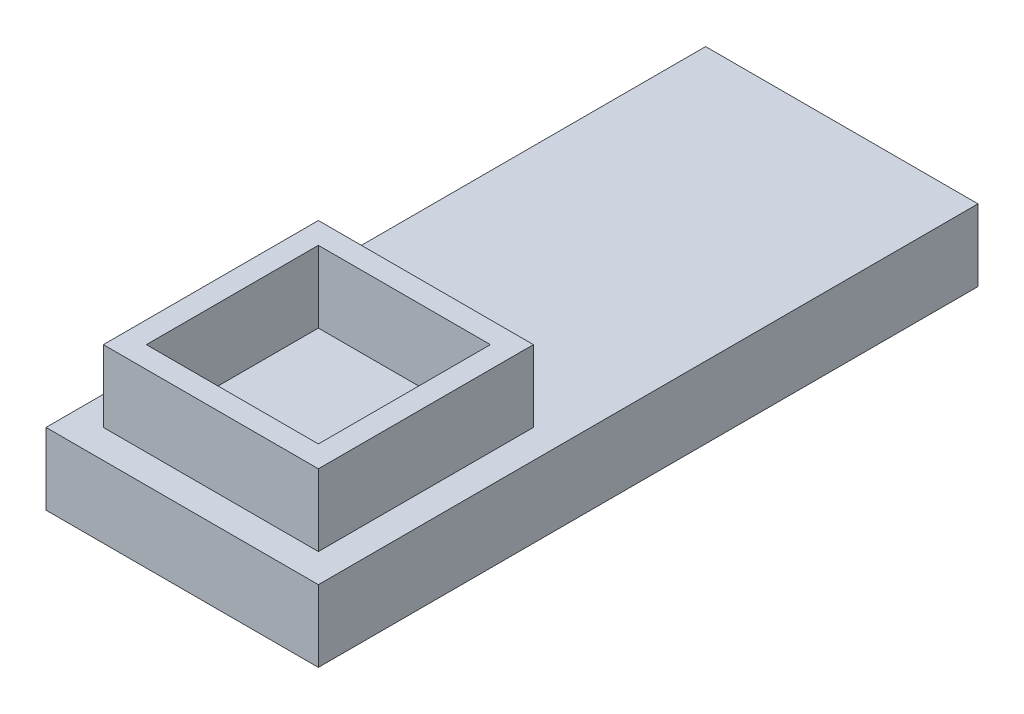
ISO-10303-21;
HEADER;
FILE_DESCRIPTION(('STEP AP214'),'2;1');
FILE_NAME('part.step','',(''),(''),'','','');
FILE_SCHEMA(('AUTOMOTIVE_DESIGN { 1 0 10303 214 1 1 1 1 }'));
ENDSEC;
DATA;
#1=APPLICATION_CONTEXT('core data for automotive mechanical design processes');
#2=APPLICATION_PROTOCOL_DEFINITION('international standard','automotive_design',2000,#1);
#3=PRODUCT_CONTEXT('',#1,'mechanical');
#4=PRODUCT('Part','Part','',(#3));
#5=PRODUCT_RELATED_PRODUCT_CATEGORY('part','',(#4));
#6=PRODUCT_DEFINITION_FORMATION('','',#4);
#7=PRODUCT_DEFINITION_CONTEXT('part definition',#1,'design');
#8=PRODUCT_DEFINITION('design','',#6,#7);
#9=PRODUCT_DEFINITION_SHAPE('','',#8);
#10=(LENGTH_UNIT() NAMED_UNIT(*) SI_UNIT(.MILLI.,.METRE.));
#11=(NAMED_UNIT(*) PLANE_ANGLE_UNIT() SI_UNIT($,.RADIAN.));
#12=(NAMED_UNIT(*) SI_UNIT($,.STERADIAN.) SOLID_ANGLE_UNIT());
#13=UNCERTAINTY_MEASURE_WITH_UNIT(LENGTH_MEASURE(1.E-05),#10,'distance_accuracy_value','');
#14=(GEOMETRIC_REPRESENTATION_CONTEXT(3) GLOBAL_UNCERTAINTY_ASSIGNED_CONTEXT((#13)) GLOBAL_UNIT_ASSIGNED_CONTEXT((#10,
#11,#12)) REPRESENTATION_CONTEXT('',''));
#15=CARTESIAN_POINT('',(0.,0.,0.));
#16=DIRECTION('',(0.,0.,1.));
#17=DIRECTION('',(1.,0.,0.));
#18=AXIS2_PLACEMENT_3D('',#15,#16,#17);
#19=CARTESIAN_POINT('',(0.,10.,0.));
#20=DIRECTION('',(0.,1.,0.));
#21=DIRECTION('',(0.,0.,1.));
#22=AXIS2_PLACEMENT_3D('',#19,#20,#21);
#23=PLANE('',#22);
#24=DIRECTION('',(0.,0.,1.));
#25=VECTOR('',#24,1.);
#26=CARTESIAN_POINT('',(-11.5829012513685,10.,-21.1276817856138));
#27=LINE('',#26,#25);
#28=CARTESIAN_POINT('',(-11.5829012513685,10.,-21.1276817856138));
#29=VERTEX_POINT('',#28);
#30=CARTESIAN_POINT('',(-11.5829012513685,10.,8.87231821438616));
#31=VERTEX_POINT('',#30);
#32=EDGE_CURVE('E101',#29,#31,#27,.T.);
#33=ORIENTED_EDGE('',*,*,#32,.T.);
#34=DIRECTION('',(1.,0.,0.));
#35=VECTOR('',#34,1.);
#36=CARTESIAN_POINT('',(-11.5829012513685,10.,8.87231821438616));
#37=LINE('',#36,#35);
#38=CARTESIAN_POINT('',(18.4170987486315,10.,8.87231821438616));
#39=VERTEX_POINT('',#38);
#40=EDGE_CURVE('E94',#31,#39,#37,.T.);
#41=ORIENTED_EDGE('',*,*,#40,.T.);
#42=DIRECTION('',(0.,0.,-1.));
#43=VECTOR('',#42,1.);
#44=CARTESIAN_POINT('',(18.4170987486315,10.,-21.1276817856138));
#45=LINE('',#44,#43);
#46=CARTESIAN_POINT('',(18.4170987486315,10.,-21.1276817856138));
#47=VERTEX_POINT('',#46);
#48=EDGE_CURVE('E98',#39,#47,#45,.T.);
#49=ORIENTED_EDGE('',*,*,#48,.T.);
#50=DIRECTION('',(-1.,0.,0.));
#51=VECTOR('',#50,1.);
#52=CARTESIAN_POINT('',(-11.5829012513685,10.,-21.1276817856138));
#53=LINE('',#52,#51);
#54=EDGE_CURVE('E57',#47,#29,#53,.T.);
#55=ORIENTED_EDGE('',*,*,#54,.T.);
#56=EDGE_LOOP('',(#33,#41,#49,#55));
#57=FACE_BOUND('',#56,.T.);
#58=DIRECTION('',(1.,0.,0.));
#59=VECTOR('',#58,1.);
#60=CARTESIAN_POINT('',(-8.58290125136849,10.,5.87231821438616));
#61=LINE('',#60,#59);
#62=CARTESIAN_POINT('',(-8.58290125136849,10.,5.87231821438616));
#63=VERTEX_POINT('',#62);
#64=CARTESIAN_POINT('',(15.4170987486315,10.,5.87231821438616));
#65=VERTEX_POINT('',#64);
#66=EDGE_CURVE('E149',#63,#65,#61,.T.);
#67=ORIENTED_EDGE('',*,*,#66,.F.);
#68=DIRECTION('',(0.,0.,1.));
#69=VECTOR('',#68,1.);
#70=CARTESIAN_POINT('',(-8.5829012513685,10.,-18.1276817856138));
#71=LINE('',#70,#69);
#72=CARTESIAN_POINT('',(-8.5829012513685,10.,-18.1276817856138));
#73=VERTEX_POINT('',#72);
#74=EDGE_CURVE('E142',#73,#63,#71,.T.);
#75=ORIENTED_EDGE('',*,*,#74,.F.);
#76=DIRECTION('',(-1.,0.,0.));
#77=VECTOR('',#76,1.);
#78=CARTESIAN_POINT('',(-8.5829012513685,10.,-18.1276817856138));
#79=LINE('',#78,#77);
#80=CARTESIAN_POINT('',(15.4170987486315,10.,-18.1276817856138));
#81=VERTEX_POINT('',#80);
#82=EDGE_CURVE('E78',#81,#73,#79,.T.);
#83=ORIENTED_EDGE('',*,*,#82,.F.);
#84=DIRECTION('',(0.,0.,-1.));
#85=VECTOR('',#84,1.);
#86=CARTESIAN_POINT('',(15.4170987486315,10.,-18.1276817856138));
#87=LINE('',#86,#85);
#88=EDGE_CURVE('E160',#65,#81,#87,.T.);
#89=ORIENTED_EDGE('',*,*,#88,.F.);
#90=EDGE_LOOP('',(#67,#75,#83,#89));
#91=FACE_BOUND('',#90,.T.);
#92=ADVANCED_FACE('F33',(#57,#91),#23,.T.);
#93=CARTESIAN_POINT('',(-11.5829012513685,10.,-21.1276817856138));
#94=DIRECTION('',(1.,0.,0.));
#95=DIRECTION('',(0.,0.,-1.));
#96=AXIS2_PLACEMENT_3D('',#93,#94,#95);
#97=PLANE('',#96);
#98=DIRECTION('',(0.,0.,1.));
#99=VECTOR('',#98,1.);
#100=CARTESIAN_POINT('',(-11.5829012513685,0.,-21.1276817856138));
#101=LINE('',#100,#99);
#102=CARTESIAN_POINT('',(-11.5829012513685,0.,-21.1276817856138));
#103=VERTEX_POINT('',#102);
#104=CARTESIAN_POINT('',(-11.5829012513685,0.,8.87231821438616));
#105=VERTEX_POINT('',#104);
#106=EDGE_CURVE('E117',#103,#105,#101,.T.);
#107=ORIENTED_EDGE('',*,*,#106,.T.);
#108=DIRECTION('',(0.,-1.,0.));
#109=VECTOR('',#108,1.);
#110=CARTESIAN_POINT('',(-11.5829012513685,10.,8.87231821438616));
#111=LINE('',#110,#109);
#112=EDGE_CURVE('E11',#31,#105,#111,.T.);
#113=ORIENTED_EDGE('',*,*,#112,.F.);
#114=ORIENTED_EDGE('',*,*,#32,.F.);
#115=DIRECTION('',(0.,-1.,0.));
#116=VECTOR('',#115,1.);
#117=CARTESIAN_POINT('',(-11.5829012513685,10.,-21.1276817856138));
#118=LINE('',#117,#116);
#119=EDGE_CURVE('E113',#29,#103,#118,.T.);
#120=ORIENTED_EDGE('',*,*,#119,.T.);
#121=EDGE_LOOP('',(#107,#113,#114,#120));
#122=FACE_BOUND('',#121,.T.);
#123=ADVANCED_FACE('F35',(#122),#97,.F.);
#124=CARTESIAN_POINT('',(-11.5829012513685,10.,8.87231821438616));
#125=DIRECTION('',(0.,0.,-1.));
#126=DIRECTION('',(-1.,0.,0.));
#127=AXIS2_PLACEMENT_3D('',#124,#125,#126);
#128=PLANE('',#127);
#129=DIRECTION('',(1.,0.,0.));
#130=VECTOR('',#129,1.);
#131=CARTESIAN_POINT('',(-11.5829012513685,0.,8.87231821438616));
#132=LINE('',#131,#130);
#133=CARTESIAN_POINT('',(18.4170987486315,0.,8.87231821438616));
#134=VERTEX_POINT('',#133);
#135=EDGE_CURVE('E107',#105,#134,#132,.T.);
#136=ORIENTED_EDGE('',*,*,#135,.T.);
#137=DIRECTION('',(0.,-1.,0.));
#138=VECTOR('',#137,1.);
#139=CARTESIAN_POINT('',(18.4170987486315,10.,8.87231821438616));
#140=LINE('',#139,#138);
#141=EDGE_CURVE('E41',#39,#134,#140,.T.);
#142=ORIENTED_EDGE('',*,*,#141,.F.);
#143=ORIENTED_EDGE('',*,*,#40,.F.);
#144=ORIENTED_EDGE('',*,*,#112,.T.);
#145=EDGE_LOOP('',(#136,#142,#143,#144));
#146=FACE_BOUND('',#145,.T.);
#147=ADVANCED_FACE('F106',(#146),#128,.F.);
#148=CARTESIAN_POINT('',(18.4170987486315,10.,-21.1276817856138));
#149=DIRECTION('',(-1.,0.,0.));
#150=DIRECTION('',(0.,0.,1.));
#151=AXIS2_PLACEMENT_3D('',#148,#149,#150);
#152=PLANE('',#151);
#153=DIRECTION('',(0.,0.,-1.));
#154=VECTOR('',#153,1.);
#155=CARTESIAN_POINT('',(18.4170987486315,0.,-21.1276817856138));
#156=LINE('',#155,#154);
#157=CARTESIAN_POINT('',(18.4170987486315,0.,-21.1276817856138));
#158=VERTEX_POINT('',#157);
#159=EDGE_CURVE('E70',#134,#158,#156,.T.);
#160=ORIENTED_EDGE('',*,*,#159,.T.);
#161=DIRECTION('',(0.,-1.,0.));
#162=VECTOR('',#161,1.);
#163=CARTESIAN_POINT('',(18.4170987486315,10.,-21.1276817856138));
#164=LINE('',#163,#162);
#165=EDGE_CURVE('E109',#47,#158,#164,.T.);
#166=ORIENTED_EDGE('',*,*,#165,.F.);
#167=ORIENTED_EDGE('',*,*,#48,.F.);
#168=ORIENTED_EDGE('',*,*,#141,.T.);
#169=EDGE_LOOP('',(#160,#166,#167,#168));
#170=FACE_BOUND('',#169,.T.);
#171=ADVANCED_FACE('F110',(#170),#152,.F.);
#172=CARTESIAN_POINT('',(-11.5829012513685,10.,-21.1276817856138));
#173=DIRECTION('',(0.,0.,1.));
#174=DIRECTION('',(1.,0.,0.));
#175=AXIS2_PLACEMENT_3D('',#172,#173,#174);
#176=PLANE('',#175);
#177=DIRECTION('',(-1.,0.,0.));
#178=VECTOR('',#177,1.);
#179=CARTESIAN_POINT('',(-11.5829012513685,0.,-21.1276817856138));
#180=LINE('',#179,#178);
#181=EDGE_CURVE('E123',#158,#103,#180,.T.);
#182=ORIENTED_EDGE('',*,*,#181,.T.);
#183=ORIENTED_EDGE('',*,*,#119,.F.);
#184=ORIENTED_EDGE('',*,*,#54,.F.);
#185=ORIENTED_EDGE('',*,*,#165,.T.);
#186=EDGE_LOOP('',(#182,#183,#184,#185));
#187=FACE_BOUND('',#186,.T.);
#188=ADVANCED_FACE('F130',(#187),#176,.F.);
#189=CARTESIAN_POINT('',(-8.5829012513685,10.,-18.1276817856138));
#190=DIRECTION('',(1.,0.,0.));
#191=DIRECTION('',(0.,0.,-1.));
#192=AXIS2_PLACEMENT_3D('',#189,#190,#191);
#193=PLANE('',#192);
#194=DIRECTION('',(0.,0.,1.));
#195=VECTOR('',#194,1.);
#196=CARTESIAN_POINT('',(-8.5829012513685,0.,-18.1276817856138));
#197=LINE('',#196,#195);
#198=CARTESIAN_POINT('',(-8.5829012513685,0.,-18.1276817856138));
#199=VERTEX_POINT('',#198);
#200=CARTESIAN_POINT('',(-8.58290125136849,0.,5.87231821438616));
#201=VERTEX_POINT('',#200);
#202=EDGE_CURVE('E166',#199,#201,#197,.T.);
#203=ORIENTED_EDGE('',*,*,#202,.F.);
#204=DIRECTION('',(0.,-1.,0.));
#205=VECTOR('',#204,1.);
#206=CARTESIAN_POINT('',(-8.5829012513685,10.,-18.1276817856138));
#207=LINE('',#206,#205);
#208=EDGE_CURVE('E147',#73,#199,#207,.T.);
#209=ORIENTED_EDGE('',*,*,#208,.F.);
#210=ORIENTED_EDGE('',*,*,#74,.T.);
#211=DIRECTION('',(0.,-1.,0.));
#212=VECTOR('',#211,1.);
#213=CARTESIAN_POINT('',(-8.58290125136849,10.,5.87231821438616));
#214=LINE('',#213,#212);
#215=EDGE_CURVE('E120',#63,#201,#214,.T.);
#216=ORIENTED_EDGE('',*,*,#215,.T.);
#217=EDGE_LOOP('',(#203,#209,#210,#216));
#218=FACE_BOUND('',#217,.T.);
#219=ADVANCED_FACE('F145',(#218),#193,.T.);
#220=CARTESIAN_POINT('',(-8.58290125136849,10.,5.87231821438616));
#221=DIRECTION('',(0.,0.,-1.));
#222=DIRECTION('',(-1.,0.,0.));
#223=AXIS2_PLACEMENT_3D('',#220,#221,#222);
#224=PLANE('',#223);
#225=DIRECTION('',(1.,0.,0.));
#226=VECTOR('',#225,1.);
#227=CARTESIAN_POINT('',(-8.58290125136849,0.,5.87231821438616));
#228=LINE('',#227,#226);
#229=CARTESIAN_POINT('',(15.4170987486315,0.,5.87231821438616));
#230=VERTEX_POINT('',#229);
#231=EDGE_CURVE('E156',#201,#230,#228,.T.);
#232=ORIENTED_EDGE('',*,*,#231,.F.);
#233=ORIENTED_EDGE('',*,*,#215,.F.);
#234=ORIENTED_EDGE('',*,*,#66,.T.);
#235=DIRECTION('',(0.,-1.,0.));
#236=VECTOR('',#235,1.);
#237=CARTESIAN_POINT('',(15.4170987486315,10.,5.87231821438616));
#238=LINE('',#237,#236);
#239=EDGE_CURVE('E157',#65,#230,#238,.T.);
#240=ORIENTED_EDGE('',*,*,#239,.T.);
#241=EDGE_LOOP('',(#232,#233,#234,#240));
#242=FACE_BOUND('',#241,.T.);
#243=ADVANCED_FACE('F153',(#242),#224,.T.);
#244=CARTESIAN_POINT('',(15.4170987486315,10.,-18.1276817856138));
#245=DIRECTION('',(-1.,0.,0.));
#246=DIRECTION('',(0.,0.,1.));
#247=AXIS2_PLACEMENT_3D('',#244,#245,#246);
#248=PLANE('',#247);
#249=DIRECTION('',(0.,0.,-1.));
#250=VECTOR('',#249,1.);
#251=CARTESIAN_POINT('',(15.4170987486315,0.,-18.1276817856138));
#252=LINE('',#251,#250);
#253=CARTESIAN_POINT('',(15.4170987486315,0.,-18.1276817856138));
#254=VERTEX_POINT('',#253);
#255=EDGE_CURVE('E170',#230,#254,#252,.T.);
#256=ORIENTED_EDGE('',*,*,#255,.F.);
#257=ORIENTED_EDGE('',*,*,#239,.F.);
#258=ORIENTED_EDGE('',*,*,#88,.T.);
#259=DIRECTION('',(0.,-1.,0.));
#260=VECTOR('',#259,1.);
#261=CARTESIAN_POINT('',(15.4170987486315,10.,-18.1276817856138));
#262=LINE('',#261,#260);
#263=EDGE_CURVE('E48',#81,#254,#262,.T.);
#264=ORIENTED_EDGE('',*,*,#263,.T.);
#265=EDGE_LOOP('',(#256,#257,#258,#264));
#266=FACE_BOUND('',#265,.T.);
#267=ADVANCED_FACE('F179',(#266),#248,.T.);
#268=CARTESIAN_POINT('',(-8.5829012513685,10.,-18.1276817856138));
#269=DIRECTION('',(0.,0.,1.));
#270=DIRECTION('',(1.,0.,0.));
#271=AXIS2_PLACEMENT_3D('',#268,#269,#270);
#272=PLANE('',#271);
#273=DIRECTION('',(-1.,0.,0.));
#274=VECTOR('',#273,1.);
#275=CARTESIAN_POINT('',(-8.5829012513685,0.,-18.1276817856138));
#276=LINE('',#275,#274);
#277=EDGE_CURVE('E150',#254,#199,#276,.T.);
#278=ORIENTED_EDGE('',*,*,#277,.F.);
#279=ORIENTED_EDGE('',*,*,#263,.F.);
#280=ORIENTED_EDGE('',*,*,#82,.T.);
#281=ORIENTED_EDGE('',*,*,#208,.T.);
#282=EDGE_LOOP('',(#278,#279,#280,#281));
#283=FACE_BOUND('',#282,.T.);
#284=ADVANCED_FACE('F306',(#283),#272,.T.);
#285=CARTESIAN_POINT('',(0.,0.,0.));
#286=DIRECTION('',(0.,-1.,0.));
#287=DIRECTION('',(0.,0.,-1.));
#288=AXIS2_PLACEMENT_3D('',#285,#286,#287);
#289=PLANE('',#288);
#290=ORIENTED_EDGE('',*,*,#277,.T.);
#291=ORIENTED_EDGE('',*,*,#202,.T.);
#292=ORIENTED_EDGE('',*,*,#231,.T.);
#293=ORIENTED_EDGE('',*,*,#255,.T.);
#294=EDGE_LOOP('',(#290,#291,#292,#293));
#295=FACE_BOUND('',#294,.T.);
#296=ADVANCED_FACE('F181',(#295),#289,.F.);
#297=CARTESIAN_POINT('',(-15.5829012513685,-10.,12.8723182143862));
#298=DIRECTION('',(-1.,0.,0.));
#299=DIRECTION('',(0.,0.,1.));
#300=AXIS2_PLACEMENT_3D('',#297,#298,#299);
#301=PLANE('',#300);
#302=DIRECTION('',(0.,0.,1.));
#303=VECTOR('',#302,1.);
#304=CARTESIAN_POINT('',(-15.5829012513685,0.,12.8723182143862));
#305=LINE('',#304,#303);
#306=CARTESIAN_POINT('',(-15.5829012513685,0.,-79.1533204456544));
#307=VERTEX_POINT('',#306);
#308=CARTESIAN_POINT('',(-15.5829012513685,0.,12.8723182143862));
#309=VERTEX_POINT('',#308);
#310=EDGE_CURVE('E240',#307,#309,#305,.T.);
#311=ORIENTED_EDGE('',*,*,#310,.F.);
#312=DIRECTION('',(0.,1.,0.));
#313=VECTOR('',#312,1.);
#314=CARTESIAN_POINT('',(-15.5829012513685,-10.,-79.1533204456544));
#315=LINE('',#314,#313);
#316=CARTESIAN_POINT('',(-15.5829012513685,-10.,-79.1533204456544));
#317=VERTEX_POINT('',#316);
#318=EDGE_CURVE('E168',#317,#307,#315,.T.);
#319=ORIENTED_EDGE('',*,*,#318,.F.);
#320=DIRECTION('',(0.,0.,1.));
#321=VECTOR('',#320,1.);
#322=CARTESIAN_POINT('',(-15.5829012513685,-10.,12.8723182143862));
#323=LINE('',#322,#321);
#324=CARTESIAN_POINT('',(-15.5829012513685,-10.,12.8723182143862));
#325=VERTEX_POINT('',#324);
#326=EDGE_CURVE('E226',#317,#325,#323,.T.);
#327=ORIENTED_EDGE('',*,*,#326,.T.);
#328=DIRECTION('',(0.,1.,0.));
#329=VECTOR('',#328,1.);
#330=CARTESIAN_POINT('',(-15.5829012513685,-10.,12.8723182143862));
#331=LINE('',#330,#329);
#332=EDGE_CURVE('E209',#325,#309,#331,.T.);
#333=ORIENTED_EDGE('',*,*,#332,.T.);
#334=EDGE_LOOP('',(#311,#319,#327,#333));
#335=FACE_BOUND('',#334,.T.);
#336=ADVANCED_FACE('F231',(#335),#301,.T.);
#337=CARTESIAN_POINT('',(-15.5829012513685,-10.,-79.1533204456544));
#338=DIRECTION('',(0.,0.,-1.));
#339=DIRECTION('',(-1.,0.,0.));
#340=AXIS2_PLACEMENT_3D('',#337,#338,#339);
#341=PLANE('',#340);
#342=DIRECTION('',(-1.,0.,0.));
#343=VECTOR('',#342,1.);
#344=CARTESIAN_POINT('',(-15.5829012513685,0.,-79.1533204456544));
#345=LINE('',#344,#343);
#346=CARTESIAN_POINT('',(22.4170987486315,0.,-79.1533204456544));
#347=VERTEX_POINT('',#346);
#348=EDGE_CURVE('E232',#347,#307,#345,.T.);
#349=ORIENTED_EDGE('',*,*,#348,.F.);
#350=DIRECTION('',(0.,1.,0.));
#351=VECTOR('',#350,1.);
#352=CARTESIAN_POINT('',(22.4170987486315,-10.,-79.1533204456544));
#353=LINE('',#352,#351);
#354=CARTESIAN_POINT('',(22.4170987486315,-10.,-79.1533204456544));
#355=VERTEX_POINT('',#354);
#356=EDGE_CURVE('E246',#355,#347,#353,.T.);
#357=ORIENTED_EDGE('',*,*,#356,.F.);
#358=DIRECTION('',(-1.,0.,0.));
#359=VECTOR('',#358,1.);
#360=CARTESIAN_POINT('',(-15.5829012513685,-10.,-79.1533204456544));
#361=LINE('',#360,#359);
#362=EDGE_CURVE('E220',#355,#317,#361,.T.);
#363=ORIENTED_EDGE('',*,*,#362,.T.);
#364=ORIENTED_EDGE('',*,*,#318,.T.);
#365=EDGE_LOOP('',(#349,#357,#363,#364));
#366=FACE_BOUND('',#365,.T.);
#367=ADVANCED_FACE('F255',(#366),#341,.T.);
#368=CARTESIAN_POINT('',(22.4170987486315,-10.,12.8723182143862));
#369=DIRECTION('',(1.,0.,0.));
#370=DIRECTION('',(0.,0.,-1.));
#371=AXIS2_PLACEMENT_3D('',#368,#369,#370);
#372=PLANE('',#371);
#373=DIRECTION('',(0.,0.,-1.));
#374=VECTOR('',#373,1.);
#375=CARTESIAN_POINT('',(22.4170987486315,0.,12.8723182143862));
#376=LINE('',#375,#374);
#377=CARTESIAN_POINT('',(22.4170987486315,0.,12.8723182143862));
#378=VERTEX_POINT('',#377);
#379=EDGE_CURVE('E235',#378,#347,#376,.T.);
#380=ORIENTED_EDGE('',*,*,#379,.F.);
#381=DIRECTION('',(0.,1.,0.));
#382=VECTOR('',#381,1.);
#383=CARTESIAN_POINT('',(22.4170987486315,-10.,12.8723182143862));
#384=LINE('',#383,#382);
#385=CARTESIAN_POINT('',(22.4170987486315,-10.,12.8723182143862));
#386=VERTEX_POINT('',#385);
#387=EDGE_CURVE('E219',#386,#378,#384,.T.);
#388=ORIENTED_EDGE('',*,*,#387,.F.);
#389=DIRECTION('',(0.,0.,-1.));
#390=VECTOR('',#389,1.);
#391=CARTESIAN_POINT('',(22.4170987486315,-10.,12.8723182143862));
#392=LINE('',#391,#390);
#393=EDGE_CURVE('E229',#386,#355,#392,.T.);
#394=ORIENTED_EDGE('',*,*,#393,.T.);
#395=ORIENTED_EDGE('',*,*,#356,.T.);
#396=EDGE_LOOP('',(#380,#388,#394,#395));
#397=FACE_BOUND('',#396,.T.);
#398=ADVANCED_FACE('F250',(#397),#372,.T.);
#399=CARTESIAN_POINT('',(-15.5829012513685,-10.,12.8723182143862));
#400=DIRECTION('',(0.,0.,1.));
#401=DIRECTION('',(1.,0.,0.));
#402=AXIS2_PLACEMENT_3D('',#399,#400,#401);
#403=PLANE('',#402);
#404=DIRECTION('',(1.,0.,0.));
#405=VECTOR('',#404,1.);
#406=CARTESIAN_POINT('',(-15.5829012513685,0.,12.8723182143862));
#407=LINE('',#406,#405);
#408=EDGE_CURVE('E214',#309,#378,#407,.T.);
#409=ORIENTED_EDGE('',*,*,#408,.F.);
#410=ORIENTED_EDGE('',*,*,#332,.F.);
#411=DIRECTION('',(1.,0.,0.));
#412=VECTOR('',#411,1.);
#413=CARTESIAN_POINT('',(-15.5829012513685,-10.,12.8723182143862));
#414=LINE('',#413,#412);
#415=EDGE_CURVE('E212',#325,#386,#414,.T.);
#416=ORIENTED_EDGE('',*,*,#415,.T.);
#417=ORIENTED_EDGE('',*,*,#387,.T.);
#418=EDGE_LOOP('',(#409,#410,#416,#417));
#419=FACE_BOUND('',#418,.T.);
#420=ADVANCED_FACE('F211',(#419),#403,.T.);
#421=CARTESIAN_POINT('',(0.,-10.,0.));
#422=DIRECTION('',(0.,-1.,0.));
#423=DIRECTION('',(0.,0.,-1.));
#424=AXIS2_PLACEMENT_3D('',#421,#422,#423);
#425=PLANE('',#424);
#426=ORIENTED_EDGE('',*,*,#326,.F.);
#427=ORIENTED_EDGE('',*,*,#362,.F.);
#428=ORIENTED_EDGE('',*,*,#393,.F.);
#429=ORIENTED_EDGE('',*,*,#415,.F.);
#430=EDGE_LOOP('',(#426,#427,#428,#429));
#431=FACE_BOUND('',#430,.T.);
#432=ADVANCED_FACE('F224',(#431),#425,.T.);
#433=ORIENTED_EDGE('',*,*,#106,.F.);
#434=ORIENTED_EDGE('',*,*,#181,.F.);
#435=ORIENTED_EDGE('',*,*,#159,.F.);
#436=ORIENTED_EDGE('',*,*,#135,.F.);
#437=EDGE_LOOP('',(#433,#434,#435,#436));
#438=FACE_BOUND('',#437,.T.);
#439=ORIENTED_EDGE('',*,*,#310,.T.);
#440=ORIENTED_EDGE('',*,*,#408,.T.);
#441=ORIENTED_EDGE('',*,*,#379,.T.);
#442=ORIENTED_EDGE('',*,*,#348,.T.);
#443=EDGE_LOOP('',(#439,#440,#441,#442));
#444=FACE_BOUND('',#443,.T.);
#445=ADVANCED_FACE('F253',(#438,#444),#289,.F.);
#446=CLOSED_SHELL('',(#92,#123,#147,#171,#188,#219,#243,#267,#284,#296,#336,#367,#398,#420,#432,#445));
#447=MANIFOLD_SOLID_BREP('B2',#446);
#448=ADVANCED_BREP_SHAPE_REPRESENTATION('',(#18,#447),#14);
#449=SHAPE_DEFINITION_REPRESENTATION(#9,#448);
ENDSEC;
END-ISO-10303-21;
